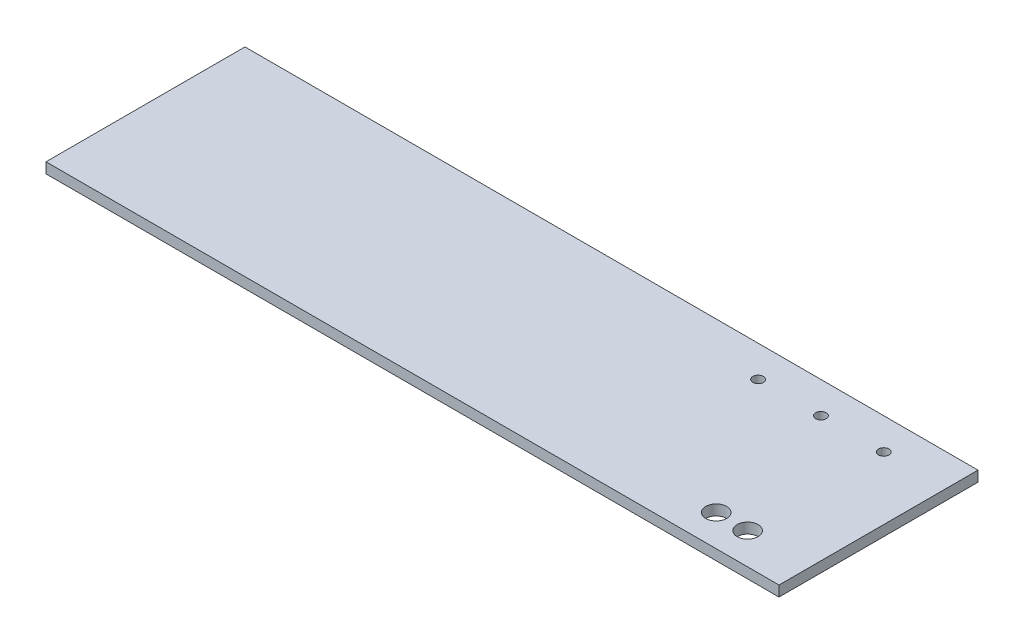
ISO-10303-21;
HEADER;
FILE_DESCRIPTION(('STEP AP214'),'2;1');
FILE_NAME('part.step','',(''),(''),'','','');
FILE_SCHEMA(('AUTOMOTIVE_DESIGN { 1 0 10303 214 1 1 1 1 }'));
ENDSEC;
DATA;
#1=APPLICATION_CONTEXT('core data for automotive mechanical design processes');
#2=APPLICATION_PROTOCOL_DEFINITION('international standard','automotive_design',2000,#1);
#3=PRODUCT_CONTEXT('',#1,'mechanical');
#4=PRODUCT('Part','Part','',(#3));
#5=PRODUCT_RELATED_PRODUCT_CATEGORY('part','',(#4));
#6=PRODUCT_DEFINITION_FORMATION('','',#4);
#7=PRODUCT_DEFINITION_CONTEXT('part definition',#1,'design');
#8=PRODUCT_DEFINITION('design','',#6,#7);
#9=PRODUCT_DEFINITION_SHAPE('','',#8);
#10=(LENGTH_UNIT() NAMED_UNIT(*) SI_UNIT(.MILLI.,.METRE.));
#11=(NAMED_UNIT(*) PLANE_ANGLE_UNIT() SI_UNIT($,.RADIAN.));
#12=(NAMED_UNIT(*) SI_UNIT($,.STERADIAN.) SOLID_ANGLE_UNIT());
#13=UNCERTAINTY_MEASURE_WITH_UNIT(LENGTH_MEASURE(1.E-05),#10,'distance_accuracy_value','');
#14=(GEOMETRIC_REPRESENTATION_CONTEXT(3) GLOBAL_UNCERTAINTY_ASSIGNED_CONTEXT((#13)) GLOBAL_UNIT_ASSIGNED_CONTEXT((#10,
#11,#12)) REPRESENTATION_CONTEXT('',''));
#15=CARTESIAN_POINT('',(0.,0.,0.));
#16=DIRECTION('',(0.,0.,1.));
#17=DIRECTION('',(1.,0.,0.));
#18=AXIS2_PLACEMENT_3D('',#15,#16,#17);
#19=CARTESIAN_POINT('',(350.,10.,95.));
#20=DIRECTION('',(-1.,0.,0.));
#21=DIRECTION('',(0.,0.,1.));
#22=AXIS2_PLACEMENT_3D('',#19,#20,#21);
#23=PLANE('',#22);
#24=DIRECTION('',(0.,0.,-1.));
#25=VECTOR('',#24,1.);
#26=CARTESIAN_POINT('',(350.,0.,95.));
#27=LINE('',#26,#25);
#28=CARTESIAN_POINT('',(350.,0.,95.));
#29=VERTEX_POINT('',#28);
#30=CARTESIAN_POINT('',(350.,0.,-95.));
#31=VERTEX_POINT('',#30);
#32=EDGE_CURVE('E96',#29,#31,#27,.T.);
#33=ORIENTED_EDGE('',*,*,#32,.T.);
#34=DIRECTION('',(0.,-1.,0.));
#35=VECTOR('',#34,1.);
#36=CARTESIAN_POINT('',(350.,10.,-95.));
#37=LINE('',#36,#35);
#38=CARTESIAN_POINT('',(350.,10.,-95.));
#39=VERTEX_POINT('',#38);
#40=EDGE_CURVE('E11',#39,#31,#37,.T.);
#41=ORIENTED_EDGE('',*,*,#40,.F.);
#42=DIRECTION('',(0.,0.,-1.));
#43=VECTOR('',#42,1.);
#44=CARTESIAN_POINT('',(350.,10.,95.));
#45=LINE('',#44,#43);
#46=CARTESIAN_POINT('',(350.,10.,95.));
#47=VERTEX_POINT('',#46);
#48=EDGE_CURVE('E84',#47,#39,#45,.T.);
#49=ORIENTED_EDGE('',*,*,#48,.F.);
#50=DIRECTION('',(0.,-1.,0.));
#51=VECTOR('',#50,1.);
#52=CARTESIAN_POINT('',(350.,10.,95.));
#53=LINE('',#52,#51);
#54=EDGE_CURVE('E92',#47,#29,#53,.T.);
#55=ORIENTED_EDGE('',*,*,#54,.T.);
#56=EDGE_LOOP('',(#33,#41,#49,#55));
#57=FACE_BOUND('',#56,.T.);
#58=ADVANCED_FACE('F33',(#57),#23,.F.);
#59=CARTESIAN_POINT('',(-350.,10.,-95.));
#60=DIRECTION('',(0.,0.,1.));
#61=DIRECTION('',(1.,0.,0.));
#62=AXIS2_PLACEMENT_3D('',#59,#60,#61);
#63=PLANE('',#62);
#64=DIRECTION('',(-1.,0.,0.));
#65=VECTOR('',#64,1.);
#66=CARTESIAN_POINT('',(-350.,0.,-95.));
#67=LINE('',#66,#65);
#68=CARTESIAN_POINT('',(-350.,0.,-95.));
#69=VERTEX_POINT('',#68);
#70=EDGE_CURVE('E88',#31,#69,#67,.T.);
#71=ORIENTED_EDGE('',*,*,#70,.T.);
#72=DIRECTION('',(0.,-1.,0.));
#73=VECTOR('',#72,1.);
#74=CARTESIAN_POINT('',(-350.,10.,-95.));
#75=LINE('',#74,#73);
#76=CARTESIAN_POINT('',(-350.,10.,-95.));
#77=VERTEX_POINT('',#76);
#78=EDGE_CURVE('E41',#77,#69,#75,.T.);
#79=ORIENTED_EDGE('',*,*,#78,.F.);
#80=DIRECTION('',(-1.,0.,0.));
#81=VECTOR('',#80,1.);
#82=CARTESIAN_POINT('',(-350.,10.,-95.));
#83=LINE('',#82,#81);
#84=EDGE_CURVE('E79',#39,#77,#83,.T.);
#85=ORIENTED_EDGE('',*,*,#84,.F.);
#86=ORIENTED_EDGE('',*,*,#40,.T.);
#87=EDGE_LOOP('',(#71,#79,#85,#86));
#88=FACE_BOUND('',#87,.T.);
#89=ADVANCED_FACE('F87',(#88),#63,.F.);
#90=CARTESIAN_POINT('',(-350.,10.,95.));
#91=DIRECTION('',(1.,0.,0.));
#92=DIRECTION('',(0.,0.,-1.));
#93=AXIS2_PLACEMENT_3D('',#90,#91,#92);
#94=PLANE('',#93);
#95=DIRECTION('',(0.,0.,1.));
#96=VECTOR('',#95,1.);
#97=CARTESIAN_POINT('',(-350.,0.,95.));
#98=LINE('',#97,#96);
#99=CARTESIAN_POINT('',(-350.,0.,95.));
#100=VERTEX_POINT('',#99);
#101=EDGE_CURVE('E66',#69,#100,#98,.T.);
#102=ORIENTED_EDGE('',*,*,#101,.T.);
#103=DIRECTION('',(0.,-1.,0.));
#104=VECTOR('',#103,1.);
#105=CARTESIAN_POINT('',(-350.,10.,95.));
#106=LINE('',#105,#104);
#107=CARTESIAN_POINT('',(-350.,10.,95.));
#108=VERTEX_POINT('',#107);
#109=EDGE_CURVE('E89',#108,#100,#106,.T.);
#110=ORIENTED_EDGE('',*,*,#109,.F.);
#111=DIRECTION('',(0.,0.,1.));
#112=VECTOR('',#111,1.);
#113=CARTESIAN_POINT('',(-350.,10.,95.));
#114=LINE('',#113,#112);
#115=EDGE_CURVE('E82',#77,#108,#114,.T.);
#116=ORIENTED_EDGE('',*,*,#115,.F.);
#117=ORIENTED_EDGE('',*,*,#78,.T.);
#118=EDGE_LOOP('',(#102,#110,#116,#117));
#119=FACE_BOUND('',#118,.T.);
#120=ADVANCED_FACE('F90',(#119),#94,.F.);
#121=CARTESIAN_POINT('',(-350.,10.,95.));
#122=DIRECTION('',(0.,0.,-1.));
#123=DIRECTION('',(-1.,0.,0.));
#124=AXIS2_PLACEMENT_3D('',#121,#122,#123);
#125=PLANE('',#124);
#126=DIRECTION('',(1.,0.,0.));
#127=VECTOR('',#126,1.);
#128=CARTESIAN_POINT('',(-350.,0.,95.));
#129=LINE('',#128,#127);
#130=EDGE_CURVE('E72',#100,#29,#129,.T.);
#131=ORIENTED_EDGE('',*,*,#130,.T.);
#132=ORIENTED_EDGE('',*,*,#54,.F.);
#133=DIRECTION('',(1.,0.,0.));
#134=VECTOR('',#133,1.);
#135=CARTESIAN_POINT('',(-350.,10.,95.));
#136=LINE('',#135,#134);
#137=EDGE_CURVE('E49',#108,#47,#136,.T.);
#138=ORIENTED_EDGE('',*,*,#137,.F.);
#139=ORIENTED_EDGE('',*,*,#109,.T.);
#140=EDGE_LOOP('',(#131,#132,#138,#139));
#141=FACE_BOUND('',#140,.T.);
#142=ADVANCED_FACE('F104',(#141),#125,.F.);
#143=CARTESIAN_POINT('',(0.,10.,0.));
#144=DIRECTION('',(0.,-1.,0.));
#145=DIRECTION('',(0.,0.,-1.));
#146=AXIS2_PLACEMENT_3D('',#143,#144,#145);
#147=PLANE('',#146);
#148=CARTESIAN_POINT('',(260.,10.,65.));
#149=DIRECTION('',(0.,1.,0.));
#150=DIRECTION('',(0.,0.,1.));
#151=AXIS2_PLACEMENT_3D('',#148,#149,#150);
#152=CIRCLE('',#151,9.99999999999998);
#153=CARTESIAN_POINT('',(260.,10.,75.));
#154=VERTEX_POINT('',#153);
#155=EDGE_CURVE('E136',#154,#154,#152,.T.);
#156=ORIENTED_EDGE('',*,*,#155,.F.);
#157=EDGE_LOOP('',(#156));
#158=FACE_BOUND('',#157,.T.);
#159=CARTESIAN_POINT('',(290.,10.,65.));
#160=DIRECTION('',(0.,1.,0.));
#161=DIRECTION('',(0.,0.,1.));
#162=AXIS2_PLACEMENT_3D('',#159,#160,#161);
#163=CIRCLE('',#162,9.99999999999998);
#164=CARTESIAN_POINT('',(290.,10.,75.));
#165=VERTEX_POINT('',#164);
#166=EDGE_CURVE('E130',#165,#165,#163,.T.);
#167=ORIENTED_EDGE('',*,*,#166,.F.);
#168=EDGE_LOOP('',(#167));
#169=FACE_BOUND('',#168,.T.);
#170=CARTESIAN_POINT('',(170.,10.,-65.));
#171=DIRECTION('',(0.,1.,0.));
#172=DIRECTION('',(0.,0.,1.));
#173=AXIS2_PLACEMENT_3D('',#170,#171,#172);
#174=CIRCLE('',#173,4.99999999999999);
#175=CARTESIAN_POINT('',(170.,10.,-60.));
#176=VERTEX_POINT('',#175);
#177=EDGE_CURVE('E124',#176,#176,#174,.T.);
#178=ORIENTED_EDGE('',*,*,#177,.F.);
#179=EDGE_LOOP('',(#178));
#180=FACE_BOUND('',#179,.T.);
#181=CARTESIAN_POINT('',(230.,10.,-65.));
#182=DIRECTION('',(0.,1.,0.));
#183=DIRECTION('',(0.,0.,1.));
#184=AXIS2_PLACEMENT_3D('',#181,#182,#183);
#185=CIRCLE('',#184,4.99999999999999);
#186=CARTESIAN_POINT('',(230.,10.,-60.));
#187=VERTEX_POINT('',#186);
#188=EDGE_CURVE('E118',#187,#187,#185,.T.);
#189=ORIENTED_EDGE('',*,*,#188,.F.);
#190=EDGE_LOOP('',(#189));
#191=FACE_BOUND('',#190,.T.);
#192=CARTESIAN_POINT('',(290.,10.,-65.));
#193=DIRECTION('',(0.,1.,0.));
#194=DIRECTION('',(0.,0.,1.));
#195=AXIS2_PLACEMENT_3D('',#192,#193,#194);
#196=CIRCLE('',#195,4.99999999999999);
#197=CARTESIAN_POINT('',(290.,10.,-60.));
#198=VERTEX_POINT('',#197);
#199=EDGE_CURVE('E112',#198,#198,#196,.T.);
#200=ORIENTED_EDGE('',*,*,#199,.F.);
#201=EDGE_LOOP('',(#200));
#202=FACE_BOUND('',#201,.T.);
#203=ORIENTED_EDGE('',*,*,#48,.T.);
#204=ORIENTED_EDGE('',*,*,#84,.T.);
#205=ORIENTED_EDGE('',*,*,#115,.T.);
#206=ORIENTED_EDGE('',*,*,#137,.T.);
#207=EDGE_LOOP('',(#203,#204,#205,#206));
#208=FACE_BOUND('',#207,.T.);
#209=ADVANCED_FACE('F80',(#158,#169,#180,#191,#202,#208),#147,.F.);
#210=CARTESIAN_POINT('',(0.,0.,0.));
#211=DIRECTION('',(0.,-1.,0.));
#212=DIRECTION('',(0.,0.,-1.));
#213=AXIS2_PLACEMENT_3D('',#210,#211,#212);
#214=PLANE('',#213);
#215=CARTESIAN_POINT('',(260.,0.,65.));
#216=DIRECTION('',(0.,-1.,0.));
#217=DIRECTION('',(0.,0.,-1.));
#218=AXIS2_PLACEMENT_3D('',#215,#216,#217);
#219=CIRCLE('',#218,9.99999999999998);
#220=CARTESIAN_POINT('',(260.,0.,55.));
#221=VERTEX_POINT('',#220);
#222=EDGE_CURVE('E133',#221,#221,#219,.F.);
#223=ORIENTED_EDGE('',*,*,#222,.T.);
#224=EDGE_LOOP('',(#223));
#225=FACE_BOUND('',#224,.T.);
#226=CARTESIAN_POINT('',(290.,0.,65.));
#227=DIRECTION('',(0.,-1.,0.));
#228=DIRECTION('',(0.,0.,-1.));
#229=AXIS2_PLACEMENT_3D('',#226,#227,#228);
#230=CIRCLE('',#229,9.99999999999998);
#231=CARTESIAN_POINT('',(290.,0.,55.));
#232=VERTEX_POINT('',#231);
#233=EDGE_CURVE('E127',#232,#232,#230,.F.);
#234=ORIENTED_EDGE('',*,*,#233,.T.);
#235=EDGE_LOOP('',(#234));
#236=FACE_BOUND('',#235,.T.);
#237=CARTESIAN_POINT('',(170.,0.,-65.));
#238=DIRECTION('',(0.,-1.,0.));
#239=DIRECTION('',(0.,0.,-1.));
#240=AXIS2_PLACEMENT_3D('',#237,#238,#239);
#241=CIRCLE('',#240,4.99999999999999);
#242=CARTESIAN_POINT('',(170.,0.,-70.));
#243=VERTEX_POINT('',#242);
#244=EDGE_CURVE('E121',#243,#243,#241,.F.);
#245=ORIENTED_EDGE('',*,*,#244,.T.);
#246=EDGE_LOOP('',(#245));
#247=FACE_BOUND('',#246,.T.);
#248=CARTESIAN_POINT('',(230.,0.,-65.));
#249=DIRECTION('',(0.,-1.,0.));
#250=DIRECTION('',(0.,0.,-1.));
#251=AXIS2_PLACEMENT_3D('',#248,#249,#250);
#252=CIRCLE('',#251,4.99999999999999);
#253=CARTESIAN_POINT('',(230.,0.,-70.));
#254=VERTEX_POINT('',#253);
#255=EDGE_CURVE('E115',#254,#254,#252,.F.);
#256=ORIENTED_EDGE('',*,*,#255,.T.);
#257=EDGE_LOOP('',(#256));
#258=FACE_BOUND('',#257,.T.);
#259=CARTESIAN_POINT('',(290.,0.,-65.));
#260=DIRECTION('',(0.,-1.,0.));
#261=DIRECTION('',(0.,0.,-1.));
#262=AXIS2_PLACEMENT_3D('',#259,#260,#261);
#263=CIRCLE('',#262,4.99999999999999);
#264=CARTESIAN_POINT('',(290.,0.,-70.));
#265=VERTEX_POINT('',#264);
#266=EDGE_CURVE('E99',#265,#265,#263,.F.);
#267=ORIENTED_EDGE('',*,*,#266,.T.);
#268=EDGE_LOOP('',(#267));
#269=FACE_BOUND('',#268,.T.);
#270=ORIENTED_EDGE('',*,*,#32,.F.);
#271=ORIENTED_EDGE('',*,*,#130,.F.);
#272=ORIENTED_EDGE('',*,*,#101,.F.);
#273=ORIENTED_EDGE('',*,*,#70,.F.);
#274=EDGE_LOOP('',(#270,#271,#272,#273));
#275=FACE_BOUND('',#274,.T.);
#276=ADVANCED_FACE('F107',(#225,#236,#247,#258,#269,#275),#214,.T.);
#277=CARTESIAN_POINT('',(290.,-28.2842712474619,-65.));
#278=DIRECTION('',(0.,1.,0.));
#279=DIRECTION('',(0.,0.,1.));
#280=AXIS2_PLACEMENT_3D('',#277,#278,#279);
#281=CYLINDRICAL_SURFACE('',#280,4.99999999999999);
#282=ORIENTED_EDGE('',*,*,#199,.T.);
#283=EDGE_LOOP('',(#282));
#284=FACE_BOUND('',#283,.T.);
#285=ORIENTED_EDGE('',*,*,#266,.F.);
#286=EDGE_LOOP('',(#285));
#287=FACE_BOUND('',#286,.T.);
#288=ADVANCED_FACE('F154',(#284,#287),#281,.F.);
#289=CARTESIAN_POINT('',(230.,-28.2842712474619,-65.));
#290=DIRECTION('',(0.,1.,0.));
#291=DIRECTION('',(0.,0.,1.));
#292=AXIS2_PLACEMENT_3D('',#289,#290,#291);
#293=CYLINDRICAL_SURFACE('',#292,4.99999999999999);
#294=ORIENTED_EDGE('',*,*,#188,.T.);
#295=EDGE_LOOP('',(#294));
#296=FACE_BOUND('',#295,.T.);
#297=ORIENTED_EDGE('',*,*,#255,.F.);
#298=EDGE_LOOP('',(#297));
#299=FACE_BOUND('',#298,.T.);
#300=ADVANCED_FACE('F157',(#296,#299),#293,.F.);
#301=CARTESIAN_POINT('',(170.,-28.2842712474619,-65.));
#302=DIRECTION('',(0.,1.,0.));
#303=DIRECTION('',(0.,0.,1.));
#304=AXIS2_PLACEMENT_3D('',#301,#302,#303);
#305=CYLINDRICAL_SURFACE('',#304,4.99999999999999);
#306=ORIENTED_EDGE('',*,*,#177,.T.);
#307=EDGE_LOOP('',(#306));
#308=FACE_BOUND('',#307,.T.);
#309=ORIENTED_EDGE('',*,*,#244,.F.);
#310=EDGE_LOOP('',(#309));
#311=FACE_BOUND('',#310,.T.);
#312=ADVANCED_FACE('F201',(#308,#311),#305,.F.);
#313=CARTESIAN_POINT('',(290.,-28.2842712474619,65.));
#314=DIRECTION('',(0.,1.,0.));
#315=DIRECTION('',(0.,0.,1.));
#316=AXIS2_PLACEMENT_3D('',#313,#314,#315);
#317=CYLINDRICAL_SURFACE('',#316,9.99999999999998);
#318=ORIENTED_EDGE('',*,*,#166,.T.);
#319=EDGE_LOOP('',(#318));
#320=FACE_BOUND('',#319,.T.);
#321=ORIENTED_EDGE('',*,*,#233,.F.);
#322=EDGE_LOOP('',(#321));
#323=FACE_BOUND('',#322,.T.);
#324=ADVANCED_FACE('F209',(#320,#323),#317,.F.);
#325=CARTESIAN_POINT('',(260.,-28.2842712474619,65.));
#326=DIRECTION('',(0.,1.,0.));
#327=DIRECTION('',(0.,0.,1.));
#328=AXIS2_PLACEMENT_3D('',#325,#326,#327);
#329=CYLINDRICAL_SURFACE('',#328,9.99999999999998);
#330=ORIENTED_EDGE('',*,*,#155,.T.);
#331=EDGE_LOOP('',(#330));
#332=FACE_BOUND('',#331,.T.);
#333=ORIENTED_EDGE('',*,*,#222,.F.);
#334=EDGE_LOOP('',(#333));
#335=FACE_BOUND('',#334,.T.);
#336=ADVANCED_FACE('F140',(#332,#335),#329,.F.);
#337=CLOSED_SHELL('',(#58,#89,#120,#142,#209,#276,#288,#300,#312,#324,#336));
#338=MANIFOLD_SOLID_BREP('B2',#337);
#339=ADVANCED_BREP_SHAPE_REPRESENTATION('',(#18,#338),#14);
#340=SHAPE_DEFINITION_REPRESENTATION(#9,#339);
ENDSEC;
END-ISO-10303-21;
